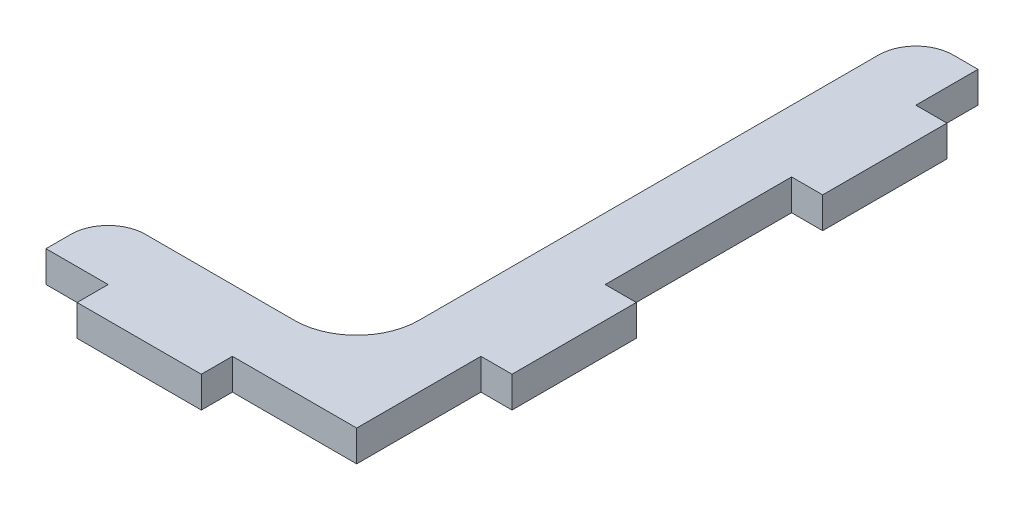
ISO-10303-21;
HEADER;
FILE_DESCRIPTION(('STEP AP214'),'2;1');
FILE_NAME('part.step','',(''),(''),'','','');
FILE_SCHEMA(('AUTOMOTIVE_DESIGN { 1 0 10303 214 1 1 1 1 }'));
ENDSEC;
DATA;
#1=APPLICATION_CONTEXT('core data for automotive mechanical design processes');
#2=APPLICATION_PROTOCOL_DEFINITION('international standard','automotive_design',2000,#1);
#3=PRODUCT_CONTEXT('',#1,'mechanical');
#4=PRODUCT('Part','Part','',(#3));
#5=PRODUCT_RELATED_PRODUCT_CATEGORY('part','',(#4));
#6=PRODUCT_DEFINITION_FORMATION('','',#4);
#7=PRODUCT_DEFINITION_CONTEXT('part definition',#1,'design');
#8=PRODUCT_DEFINITION('design','',#6,#7);
#9=PRODUCT_DEFINITION_SHAPE('','',#8);
#10=(LENGTH_UNIT() NAMED_UNIT(*) SI_UNIT(.MILLI.,.METRE.));
#11=(NAMED_UNIT(*) PLANE_ANGLE_UNIT() SI_UNIT($,.RADIAN.));
#12=(NAMED_UNIT(*) SI_UNIT($,.STERADIAN.) SOLID_ANGLE_UNIT());
#13=UNCERTAINTY_MEASURE_WITH_UNIT(LENGTH_MEASURE(1.E-05),#10,'distance_accuracy_value','');
#14=(GEOMETRIC_REPRESENTATION_CONTEXT(3) GLOBAL_UNCERTAINTY_ASSIGNED_CONTEXT((#13)) GLOBAL_UNIT_ASSIGNED_CONTEXT((#10,
#11,#12)) REPRESENTATION_CONTEXT('',''));
#15=CARTESIAN_POINT('',(0.,0.,0.));
#16=DIRECTION('',(0.,0.,1.));
#17=DIRECTION('',(1.,0.,0.));
#18=AXIS2_PLACEMENT_3D('',#15,#16,#17);
#19=CARTESIAN_POINT('',(-9.5,-2.5,23.));
#20=DIRECTION('',(0.,-1.,0.));
#21=DIRECTION('',(0.,0.,-1.));
#22=AXIS2_PLACEMENT_3D('',#19,#20,#21);
#23=CYLINDRICAL_SURFACE('',#22,3.);
#24=CARTESIAN_POINT('',(-9.5,-2.5,23.));
#25=DIRECTION('',(0.,-1.,0.));
#26=DIRECTION('',(0.,0.,1.));
#27=AXIS2_PLACEMENT_3D('',#24,#25,#26);
#28=CIRCLE('',#27,3.);
#29=CARTESIAN_POINT('',(-12.5,-2.5,23.));
#30=VERTEX_POINT('',#29);
#31=CARTESIAN_POINT('',(-9.5,-2.5,20.));
#32=VERTEX_POINT('',#31);
#33=EDGE_CURVE('E287',#30,#32,#28,.T.);
#34=ORIENTED_EDGE('',*,*,#33,.F.);
#35=DIRECTION('',(0.,-1.,0.));
#36=VECTOR('',#35,1.);
#37=CARTESIAN_POINT('',(-12.5,-2.5,23.));
#38=LINE('',#37,#36);
#39=CARTESIAN_POINT('',(-12.5,0.,23.));
#40=VERTEX_POINT('',#39);
#41=EDGE_CURVE('E381',#40,#30,#38,.T.);
#42=ORIENTED_EDGE('',*,*,#41,.F.);
#43=CARTESIAN_POINT('',(-9.5,0.,23.));
#44=DIRECTION('',(0.,1.,0.));
#45=DIRECTION('',(0.,0.,1.));
#46=AXIS2_PLACEMENT_3D('',#43,#44,#45);
#47=CIRCLE('',#46,3.);
#48=CARTESIAN_POINT('',(-9.5,0.,20.));
#49=VERTEX_POINT('',#48);
#50=EDGE_CURVE('E304',#49,#40,#47,.T.);
#51=ORIENTED_EDGE('',*,*,#50,.F.);
#52=DIRECTION('',(0.,1.,0.));
#53=VECTOR('',#52,1.);
#54=CARTESIAN_POINT('',(-9.5,0.,20.));
#55=LINE('',#54,#53);
#56=EDGE_CURVE('E26',#32,#49,#55,.T.);
#57=ORIENTED_EDGE('',*,*,#56,.F.);
#58=EDGE_LOOP('',(#34,#42,#51,#57));
#59=FACE_BOUND('',#58,.T.);
#60=ADVANCED_FACE('F17',(#59),#23,.T.);
#61=CARTESIAN_POINT('',(10.5,-2.5,-22.));
#62=DIRECTION('',(0.,-1.,0.));
#63=DIRECTION('',(0.,0.,-1.));
#64=AXIS2_PLACEMENT_3D('',#61,#62,#63);
#65=CYLINDRICAL_SURFACE('',#64,3.);
#66=CARTESIAN_POINT('',(10.5,-2.5,-22.));
#67=DIRECTION('',(0.,-1.,0.));
#68=DIRECTION('',(0.,0.,1.));
#69=AXIS2_PLACEMENT_3D('',#66,#67,#68);
#70=CIRCLE('',#69,3.);
#71=CARTESIAN_POINT('',(7.5,-2.5,-22.));
#72=VERTEX_POINT('',#71);
#73=CARTESIAN_POINT('',(10.5,-2.5,-25.));
#74=VERTEX_POINT('',#73);
#75=EDGE_CURVE('E234',#72,#74,#70,.T.);
#76=ORIENTED_EDGE('',*,*,#75,.F.);
#77=DIRECTION('',(0.,-1.,0.));
#78=VECTOR('',#77,1.);
#79=CARTESIAN_POINT('',(7.5,-2.5,-22.));
#80=LINE('',#79,#78);
#81=CARTESIAN_POINT('',(7.5,0.,-22.));
#82=VERTEX_POINT('',#81);
#83=EDGE_CURVE('E223',#82,#72,#80,.T.);
#84=ORIENTED_EDGE('',*,*,#83,.F.);
#85=CARTESIAN_POINT('',(10.5,0.,-22.));
#86=DIRECTION('',(0.,1.,0.));
#87=DIRECTION('',(0.,0.,1.));
#88=AXIS2_PLACEMENT_3D('',#85,#86,#87);
#89=CIRCLE('',#88,3.);
#90=CARTESIAN_POINT('',(10.5,0.,-25.));
#91=VERTEX_POINT('',#90);
#92=EDGE_CURVE('E293',#91,#82,#89,.T.);
#93=ORIENTED_EDGE('',*,*,#92,.F.);
#94=DIRECTION('',(0.,1.,0.));
#95=VECTOR('',#94,1.);
#96=CARTESIAN_POINT('',(10.5,0.,-25.));
#97=LINE('',#96,#95);
#98=EDGE_CURVE('E237',#74,#91,#97,.T.);
#99=ORIENTED_EDGE('',*,*,#98,.F.);
#100=EDGE_LOOP('',(#76,#84,#93,#99));
#101=FACE_BOUND('',#100,.T.);
#102=ADVANCED_FACE('F235',(#101),#65,.T.);
#103=CARTESIAN_POINT('',(2.5,-2.5,15.));
#104=DIRECTION('',(0.,-1.,0.));
#105=DIRECTION('',(0.,0.,-1.));
#106=AXIS2_PLACEMENT_3D('',#103,#104,#105);
#107=CYLINDRICAL_SURFACE('',#106,5.);
#108=CARTESIAN_POINT('',(2.5,-2.5,15.));
#109=DIRECTION('',(0.,1.,0.));
#110=DIRECTION('',(0.,0.,1.));
#111=AXIS2_PLACEMENT_3D('',#108,#109,#110);
#112=CIRCLE('',#111,5.);
#113=CARTESIAN_POINT('',(2.5,-2.5,20.));
#114=VERTEX_POINT('',#113);
#115=CARTESIAN_POINT('',(7.5,-2.5,15.));
#116=VERTEX_POINT('',#115);
#117=EDGE_CURVE('E246',#114,#116,#112,.T.);
#118=ORIENTED_EDGE('',*,*,#117,.F.);
#119=DIRECTION('',(0.,-1.,0.));
#120=VECTOR('',#119,1.);
#121=CARTESIAN_POINT('',(2.5,-2.5,20.));
#122=LINE('',#121,#120);
#123=CARTESIAN_POINT('',(2.5,0.,20.));
#124=VERTEX_POINT('',#123);
#125=EDGE_CURVE('E11',#124,#114,#122,.T.);
#126=ORIENTED_EDGE('',*,*,#125,.F.);
#127=CARTESIAN_POINT('',(2.5,0.,15.));
#128=DIRECTION('',(0.,-1.,0.));
#129=DIRECTION('',(0.,0.,1.));
#130=AXIS2_PLACEMENT_3D('',#127,#128,#129);
#131=CIRCLE('',#130,5.);
#132=CARTESIAN_POINT('',(7.5,0.,15.));
#133=VERTEX_POINT('',#132);
#134=EDGE_CURVE('E296',#133,#124,#131,.T.);
#135=ORIENTED_EDGE('',*,*,#134,.F.);
#136=DIRECTION('',(0.,1.,0.));
#137=VECTOR('',#136,1.);
#138=CARTESIAN_POINT('',(7.5,0.,15.));
#139=LINE('',#138,#137);
#140=EDGE_CURVE('E215',#116,#133,#139,.T.);
#141=ORIENTED_EDGE('',*,*,#140,.F.);
#142=EDGE_LOOP('',(#118,#126,#135,#141));
#143=FACE_BOUND('',#142,.T.);
#144=ADVANCED_FACE('F490',(#143),#107,.F.);
#145=CARTESIAN_POINT('',(-12.5,-2.5,20.));
#146=DIRECTION('',(0.,0.,1.));
#147=DIRECTION('',(1.,0.,0.));
#148=AXIS2_PLACEMENT_3D('',#145,#146,#147);
#149=PLANE('',#148);
#150=DIRECTION('',(1.,0.,0.));
#151=VECTOR('',#150,1.);
#152=CARTESIAN_POINT('',(-12.5,-2.5,20.));
#153=LINE('',#152,#151);
#154=EDGE_CURVE('E288',#32,#114,#153,.T.);
#155=ORIENTED_EDGE('',*,*,#154,.F.);
#156=ORIENTED_EDGE('',*,*,#56,.T.);
#157=DIRECTION('',(1.,0.,0.));
#158=VECTOR('',#157,1.);
#159=CARTESIAN_POINT('',(-12.5,0.,20.));
#160=LINE('',#159,#158);
#161=EDGE_CURVE('E300',#49,#124,#160,.T.);
#162=ORIENTED_EDGE('',*,*,#161,.T.);
#163=ORIENTED_EDGE('',*,*,#125,.T.);
#164=EDGE_LOOP('',(#155,#156,#162,#163));
#165=FACE_BOUND('',#164,.T.);
#166=ADVANCED_FACE('F489',(#165),#149,.F.);
#167=CARTESIAN_POINT('',(7.5,-2.5,-25.));
#168=DIRECTION('',(1.,0.,0.));
#169=DIRECTION('',(0.,0.,-1.));
#170=AXIS2_PLACEMENT_3D('',#167,#168,#169);
#171=PLANE('',#170);
#172=DIRECTION('',(0.,0.,-1.));
#173=VECTOR('',#172,1.);
#174=CARTESIAN_POINT('',(7.5,0.,-25.));
#175=LINE('',#174,#173);
#176=EDGE_CURVE('E229',#133,#82,#175,.T.);
#177=ORIENTED_EDGE('',*,*,#176,.T.);
#178=ORIENTED_EDGE('',*,*,#83,.T.);
#179=DIRECTION('',(0.,0.,-1.));
#180=VECTOR('',#179,1.);
#181=CARTESIAN_POINT('',(7.5,-2.5,-25.));
#182=LINE('',#181,#180);
#183=EDGE_CURVE('E227',#116,#72,#182,.T.);
#184=ORIENTED_EDGE('',*,*,#183,.F.);
#185=ORIENTED_EDGE('',*,*,#140,.T.);
#186=EDGE_LOOP('',(#177,#178,#184,#185));
#187=FACE_BOUND('',#186,.T.);
#188=ADVANCED_FACE('F225',(#187),#171,.F.);
#189=CARTESIAN_POINT('',(15.,0.,0.));
#190=DIRECTION('',(-1.,0.,0.));
#191=DIRECTION('',(0.,0.,1.));
#192=AXIS2_PLACEMENT_3D('',#189,#190,#191);
#193=PLANE('',#192);
#194=DIRECTION('',(0.,1.,0.));
#195=VECTOR('',#194,1.);
#196=CARTESIAN_POINT('',(15.,-2.5,5.));
#197=LINE('',#196,#195);
#198=CARTESIAN_POINT('',(15.,-2.5,5.));
#199=VERTEX_POINT('',#198);
#200=CARTESIAN_POINT('',(15.,0.,5.));
#201=VERTEX_POINT('',#200);
#202=EDGE_CURVE('E103',#199,#201,#197,.T.);
#203=ORIENTED_EDGE('',*,*,#202,.T.);
#204=DIRECTION('',(0.,0.,1.));
#205=VECTOR('',#204,1.);
#206=CARTESIAN_POINT('',(15.,0.,15.));
#207=LINE('',#206,#205);
#208=CARTESIAN_POINT('',(15.,0.,15.));
#209=VERTEX_POINT('',#208);
#210=EDGE_CURVE('E317',#201,#209,#207,.T.);
#211=ORIENTED_EDGE('',*,*,#210,.T.);
#212=DIRECTION('',(0.,-1.,0.));
#213=VECTOR('',#212,1.);
#214=CARTESIAN_POINT('',(15.,-2.5,15.));
#215=LINE('',#214,#213);
#216=CARTESIAN_POINT('',(15.,-2.5,15.));
#217=VERTEX_POINT('',#216);
#218=EDGE_CURVE('E115',#209,#217,#215,.T.);
#219=ORIENTED_EDGE('',*,*,#218,.T.);
#220=DIRECTION('',(0.,0.,-1.));
#221=VECTOR('',#220,1.);
#222=CARTESIAN_POINT('',(15.,-2.5,15.));
#223=LINE('',#222,#221);
#224=EDGE_CURVE('E273',#217,#199,#223,.T.);
#225=ORIENTED_EDGE('',*,*,#224,.T.);
#226=EDGE_LOOP('',(#203,#211,#219,#225));
#227=FACE_BOUND('',#226,.T.);
#228=ADVANCED_FACE('F638',(#227),#193,.F.);
#229=CARTESIAN_POINT('',(15.,-2.5,15.));
#230=DIRECTION('',(0.,0.,-1.));
#231=DIRECTION('',(0.,-1.,0.));
#232=AXIS2_PLACEMENT_3D('',#229,#230,#231);
#233=PLANE('',#232);
#234=DIRECTION('',(0.,-1.,0.));
#235=VECTOR('',#234,1.);
#236=CARTESIAN_POINT('',(12.5,-2.5,15.));
#237=LINE('',#236,#235);
#238=CARTESIAN_POINT('',(12.5,0.,15.));
#239=VERTEX_POINT('',#238);
#240=CARTESIAN_POINT('',(12.5,-2.5,15.));
#241=VERTEX_POINT('',#240);
#242=EDGE_CURVE('E364',#239,#241,#237,.T.);
#243=ORIENTED_EDGE('',*,*,#242,.T.);
#244=DIRECTION('',(-1.,0.,0.));
#245=VECTOR('',#244,1.);
#246=CARTESIAN_POINT('',(15.,-2.5,15.));
#247=LINE('',#246,#245);
#248=EDGE_CURVE('E274',#217,#241,#247,.T.);
#249=ORIENTED_EDGE('',*,*,#248,.F.);
#250=ORIENTED_EDGE('',*,*,#218,.F.);
#251=DIRECTION('',(-1.,0.,0.));
#252=VECTOR('',#251,1.);
#253=CARTESIAN_POINT('',(15.,0.,15.));
#254=LINE('',#253,#252);
#255=EDGE_CURVE('E314',#209,#239,#254,.T.);
#256=ORIENTED_EDGE('',*,*,#255,.T.);
#257=EDGE_LOOP('',(#243,#249,#250,#256));
#258=FACE_BOUND('',#257,.T.);
#259=ADVANCED_FACE('F627',(#258),#233,.F.);
#260=CARTESIAN_POINT('',(15.,-2.5,5.));
#261=DIRECTION('',(0.,0.,1.));
#262=DIRECTION('',(1.,0.,0.));
#263=AXIS2_PLACEMENT_3D('',#260,#261,#262);
#264=PLANE('',#263);
#265=DIRECTION('',(0.,1.,0.));
#266=VECTOR('',#265,1.);
#267=CARTESIAN_POINT('',(12.5,-2.5,5.));
#268=LINE('',#267,#266);
#269=CARTESIAN_POINT('',(12.5,-2.5,5.));
#270=VERTEX_POINT('',#269);
#271=CARTESIAN_POINT('',(12.5,0.,5.));
#272=VERTEX_POINT('',#271);
#273=EDGE_CURVE('E1263',#270,#272,#268,.T.);
#274=ORIENTED_EDGE('',*,*,#273,.T.);
#275=DIRECTION('',(-1.,0.,0.));
#276=VECTOR('',#275,1.);
#277=CARTESIAN_POINT('',(15.,0.,5.));
#278=LINE('',#277,#276);
#279=EDGE_CURVE('E269',#201,#272,#278,.T.);
#280=ORIENTED_EDGE('',*,*,#279,.F.);
#281=ORIENTED_EDGE('',*,*,#202,.F.);
#282=DIRECTION('',(-1.,0.,0.));
#283=VECTOR('',#282,1.);
#284=CARTESIAN_POINT('',(15.,-2.5,5.));
#285=LINE('',#284,#283);
#286=EDGE_CURVE('E270',#199,#270,#285,.T.);
#287=ORIENTED_EDGE('',*,*,#286,.T.);
#288=EDGE_LOOP('',(#274,#280,#281,#287));
#289=FACE_BOUND('',#288,.T.);
#290=ADVANCED_FACE('F617',(#289),#264,.F.);
#291=CARTESIAN_POINT('',(15.,0.,0.));
#292=DIRECTION('',(1.,0.,0.));
#293=DIRECTION('',(0.,1.,0.));
#294=AXIS2_PLACEMENT_3D('',#291,#292,#293);
#295=PLANE('',#294);
#296=DIRECTION('',(0.,-1.,0.));
#297=VECTOR('',#296,1.);
#298=CARTESIAN_POINT('',(15.,-2.5,-10.));
#299=LINE('',#298,#297);
#300=CARTESIAN_POINT('',(15.,0.,-10.));
#301=VERTEX_POINT('',#300);
#302=CARTESIAN_POINT('',(15.,-2.5,-10.));
#303=VERTEX_POINT('',#302);
#304=EDGE_CURVE('E333',#301,#303,#299,.T.);
#305=ORIENTED_EDGE('',*,*,#304,.T.);
#306=DIRECTION('',(0.,0.,-1.));
#307=VECTOR('',#306,1.);
#308=CARTESIAN_POINT('',(15.,-2.5,-20.));
#309=LINE('',#308,#307);
#310=CARTESIAN_POINT('',(15.,-2.5,-20.));
#311=VERTEX_POINT('',#310);
#312=EDGE_CURVE('E261',#303,#311,#309,.T.);
#313=ORIENTED_EDGE('',*,*,#312,.T.);
#314=DIRECTION('',(0.,1.,0.));
#315=VECTOR('',#314,1.);
#316=CARTESIAN_POINT('',(15.,-2.5,-20.));
#317=LINE('',#316,#315);
#318=CARTESIAN_POINT('',(15.,0.,-20.));
#319=VERTEX_POINT('',#318);
#320=EDGE_CURVE('E39',#311,#319,#317,.T.);
#321=ORIENTED_EDGE('',*,*,#320,.T.);
#322=DIRECTION('',(0.,0.,1.));
#323=VECTOR('',#322,1.);
#324=CARTESIAN_POINT('',(15.,0.,-20.));
#325=LINE('',#324,#323);
#326=EDGE_CURVE('E268',#319,#301,#325,.T.);
#327=ORIENTED_EDGE('',*,*,#326,.T.);
#328=EDGE_LOOP('',(#305,#313,#321,#327));
#329=FACE_BOUND('',#328,.T.);
#330=ADVANCED_FACE('F554',(#329),#295,.T.);
#331=CARTESIAN_POINT('',(15.,-2.5,-20.));
#332=DIRECTION('',(0.,0.,1.));
#333=DIRECTION('',(1.,0.,0.));
#334=AXIS2_PLACEMENT_3D('',#331,#332,#333);
#335=PLANE('',#334);
#336=DIRECTION('',(0.,1.,0.));
#337=VECTOR('',#336,1.);
#338=CARTESIAN_POINT('',(12.5,-2.5,-20.));
#339=LINE('',#338,#337);
#340=CARTESIAN_POINT('',(12.5,-2.5,-20.));
#341=VERTEX_POINT('',#340);
#342=CARTESIAN_POINT('',(12.5,0.,-20.));
#343=VERTEX_POINT('',#342);
#344=EDGE_CURVE('E413',#341,#343,#339,.T.);
#345=ORIENTED_EDGE('',*,*,#344,.T.);
#346=DIRECTION('',(-1.,0.,0.));
#347=VECTOR('',#346,1.);
#348=CARTESIAN_POINT('',(15.,0.,-20.));
#349=LINE('',#348,#347);
#350=EDGE_CURVE('E324',#319,#343,#349,.T.);
#351=ORIENTED_EDGE('',*,*,#350,.F.);
#352=ORIENTED_EDGE('',*,*,#320,.F.);
#353=DIRECTION('',(-1.,0.,0.));
#354=VECTOR('',#353,1.);
#355=CARTESIAN_POINT('',(15.,-2.5,-20.));
#356=LINE('',#355,#354);
#357=EDGE_CURVE('E242',#311,#341,#356,.T.);
#358=ORIENTED_EDGE('',*,*,#357,.T.);
#359=EDGE_LOOP('',(#345,#351,#352,#358));
#360=FACE_BOUND('',#359,.T.);
#361=ADVANCED_FACE('F548',(#360),#335,.F.);
#362=CARTESIAN_POINT('',(15.,-2.5,-10.));
#363=DIRECTION('',(0.,0.,-1.));
#364=DIRECTION('',(0.,-1.,0.));
#365=AXIS2_PLACEMENT_3D('',#362,#363,#364);
#366=PLANE('',#365);
#367=DIRECTION('',(0.,-1.,0.));
#368=VECTOR('',#367,1.);
#369=CARTESIAN_POINT('',(12.5,-2.5,-10.));
#370=LINE('',#369,#368);
#371=CARTESIAN_POINT('',(12.5,0.,-10.));
#372=VERTEX_POINT('',#371);
#373=CARTESIAN_POINT('',(12.5,-2.5,-10.));
#374=VERTEX_POINT('',#373);
#375=EDGE_CURVE('E352',#372,#374,#370,.T.);
#376=ORIENTED_EDGE('',*,*,#375,.T.);
#377=DIRECTION('',(-1.,0.,0.));
#378=VECTOR('',#377,1.);
#379=CARTESIAN_POINT('',(15.,-2.5,-10.));
#380=LINE('',#379,#378);
#381=EDGE_CURVE('E264',#303,#374,#380,.T.);
#382=ORIENTED_EDGE('',*,*,#381,.F.);
#383=ORIENTED_EDGE('',*,*,#304,.F.);
#384=DIRECTION('',(-1.,0.,0.));
#385=VECTOR('',#384,1.);
#386=CARTESIAN_POINT('',(15.,0.,-10.));
#387=LINE('',#386,#385);
#388=EDGE_CURVE('E265',#301,#372,#387,.T.);
#389=ORIENTED_EDGE('',*,*,#388,.T.);
#390=EDGE_LOOP('',(#376,#382,#383,#389));
#391=FACE_BOUND('',#390,.T.);
#392=ADVANCED_FACE('F553',(#391),#366,.F.);
#393=CARTESIAN_POINT('',(0.,0.,27.5));
#394=DIRECTION('',(0.,0.,1.));
#395=DIRECTION('',(1.,0.,0.));
#396=AXIS2_PLACEMENT_3D('',#393,#394,#395);
#397=PLANE('',#396);
#398=DIRECTION('',(0.,-1.,0.));
#399=VECTOR('',#398,1.);
#400=CARTESIAN_POINT('',(-7.5,-2.5,27.5));
#401=LINE('',#400,#399);
#402=CARTESIAN_POINT('',(-7.5,0.,27.5));
#403=VERTEX_POINT('',#402);
#404=CARTESIAN_POINT('',(-7.5,-2.5,27.5));
#405=VERTEX_POINT('',#404);
#406=EDGE_CURVE('E327',#403,#405,#401,.T.);
#407=ORIENTED_EDGE('',*,*,#406,.T.);
#408=DIRECTION('',(1.,0.,0.));
#409=VECTOR('',#408,1.);
#410=CARTESIAN_POINT('',(2.5,-2.5,27.5));
#411=LINE('',#410,#409);
#412=CARTESIAN_POINT('',(2.5,-2.5,27.5));
#413=VERTEX_POINT('',#412);
#414=EDGE_CURVE('E280',#405,#413,#411,.T.);
#415=ORIENTED_EDGE('',*,*,#414,.T.);
#416=DIRECTION('',(0.,1.,0.));
#417=VECTOR('',#416,1.);
#418=CARTESIAN_POINT('',(2.5,-2.5,27.5));
#419=LINE('',#418,#417);
#420=CARTESIAN_POINT('',(2.5,0.,27.5));
#421=VERTEX_POINT('',#420);
#422=EDGE_CURVE('E330',#413,#421,#419,.T.);
#423=ORIENTED_EDGE('',*,*,#422,.T.);
#424=DIRECTION('',(-1.,0.,0.));
#425=VECTOR('',#424,1.);
#426=CARTESIAN_POINT('',(2.5,0.,27.5));
#427=LINE('',#426,#425);
#428=EDGE_CURVE('E310',#421,#403,#427,.T.);
#429=ORIENTED_EDGE('',*,*,#428,.T.);
#430=EDGE_LOOP('',(#407,#415,#423,#429));
#431=FACE_BOUND('',#430,.T.);
#432=ADVANCED_FACE('F472',(#431),#397,.T.);
#433=CARTESIAN_POINT('',(2.5,-2.5,27.5));
#434=DIRECTION('',(-1.,0.,0.));
#435=DIRECTION('',(0.,0.,1.));
#436=AXIS2_PLACEMENT_3D('',#433,#434,#435);
#437=PLANE('',#436);
#438=DIRECTION('',(0.,1.,0.));
#439=VECTOR('',#438,1.);
#440=CARTESIAN_POINT('',(2.5,-2.5,25.));
#441=LINE('',#440,#439);
#442=CARTESIAN_POINT('',(2.5,-2.5,25.));
#443=VERTEX_POINT('',#442);
#444=CARTESIAN_POINT('',(2.5,0.,25.));
#445=VERTEX_POINT('',#444);
#446=EDGE_CURVE('E440',#443,#445,#441,.T.);
#447=ORIENTED_EDGE('',*,*,#446,.T.);
#448=DIRECTION('',(0.,0.,-1.));
#449=VECTOR('',#448,1.);
#450=CARTESIAN_POINT('',(2.5,0.,27.5));
#451=LINE('',#450,#449);
#452=EDGE_CURVE('E311',#421,#445,#451,.T.);
#453=ORIENTED_EDGE('',*,*,#452,.F.);
#454=ORIENTED_EDGE('',*,*,#422,.F.);
#455=DIRECTION('',(0.,0.,-1.));
#456=VECTOR('',#455,1.);
#457=CARTESIAN_POINT('',(2.5,-2.5,27.5));
#458=LINE('',#457,#456);
#459=EDGE_CURVE('E277',#413,#443,#458,.T.);
#460=ORIENTED_EDGE('',*,*,#459,.T.);
#461=EDGE_LOOP('',(#447,#453,#454,#460));
#462=FACE_BOUND('',#461,.T.);
#463=ADVANCED_FACE('F469',(#462),#437,.F.);
#464=CARTESIAN_POINT('',(-7.5,-2.5,27.5));
#465=DIRECTION('',(1.,0.,0.));
#466=DIRECTION('',(0.,1.,0.));
#467=AXIS2_PLACEMENT_3D('',#464,#465,#466);
#468=PLANE('',#467);
#469=DIRECTION('',(0.,-1.,0.));
#470=VECTOR('',#469,1.);
#471=CARTESIAN_POINT('',(-7.5,-2.5,25.));
#472=LINE('',#471,#470);
#473=CARTESIAN_POINT('',(-7.5,0.,25.));
#474=VERTEX_POINT('',#473);
#475=CARTESIAN_POINT('',(-7.5,-2.5,25.));
#476=VERTEX_POINT('',#475);
#477=EDGE_CURVE('E394',#474,#476,#472,.T.);
#478=ORIENTED_EDGE('',*,*,#477,.T.);
#479=DIRECTION('',(0.,0.,-1.));
#480=VECTOR('',#479,1.);
#481=CARTESIAN_POINT('',(-7.5,-2.5,27.5));
#482=LINE('',#481,#480);
#483=EDGE_CURVE('E284',#405,#476,#482,.T.);
#484=ORIENTED_EDGE('',*,*,#483,.F.);
#485=ORIENTED_EDGE('',*,*,#406,.F.);
#486=DIRECTION('',(0.,0.,-1.));
#487=VECTOR('',#486,1.);
#488=CARTESIAN_POINT('',(-7.5,0.,27.5));
#489=LINE('',#488,#487);
#490=EDGE_CURVE('E307',#403,#474,#489,.T.);
#491=ORIENTED_EDGE('',*,*,#490,.T.);
#492=EDGE_LOOP('',(#478,#484,#485,#491));
#493=FACE_BOUND('',#492,.T.);
#494=ADVANCED_FACE('F482',(#493),#468,.F.);
#495=CARTESIAN_POINT('',(0.,0.,0.));
#496=DIRECTION('',(0.,1.,0.));
#497=DIRECTION('',(1.,0.,0.));
#498=AXIS2_PLACEMENT_3D('',#495,#496,#497);
#499=PLANE('',#498);
#500=DIRECTION('',(-1.,0.,0.));
#501=VECTOR('',#500,1.);
#502=CARTESIAN_POINT('',(12.5,0.,-25.));
#503=LINE('',#502,#501);
#504=CARTESIAN_POINT('',(12.5,0.,-25.));
#505=VERTEX_POINT('',#504);
#506=EDGE_CURVE('E421',#505,#91,#503,.T.);
#507=ORIENTED_EDGE('',*,*,#506,.T.);
#508=ORIENTED_EDGE('',*,*,#92,.T.);
#509=ORIENTED_EDGE('',*,*,#176,.F.);
#510=ORIENTED_EDGE('',*,*,#134,.T.);
#511=ORIENTED_EDGE('',*,*,#161,.F.);
#512=ORIENTED_EDGE('',*,*,#50,.T.);
#513=DIRECTION('',(0.,0.,1.));
#514=VECTOR('',#513,1.);
#515=CARTESIAN_POINT('',(-12.5,0.,25.));
#516=LINE('',#515,#514);
#517=CARTESIAN_POINT('',(-12.5,0.,25.));
#518=VERTEX_POINT('',#517);
#519=EDGE_CURVE('E386',#40,#518,#516,.T.);
#520=ORIENTED_EDGE('',*,*,#519,.T.);
#521=DIRECTION('',(1.,0.,0.));
#522=VECTOR('',#521,1.);
#523=CARTESIAN_POINT('',(12.5,0.,25.));
#524=LINE('',#523,#522);
#525=EDGE_CURVE('E376',#518,#474,#524,.T.);
#526=ORIENTED_EDGE('',*,*,#525,.T.);
#527=ORIENTED_EDGE('',*,*,#490,.F.);
#528=ORIENTED_EDGE('',*,*,#428,.F.);
#529=ORIENTED_EDGE('',*,*,#452,.T.);
#530=DIRECTION('',(1.,0.,0.));
#531=VECTOR('',#530,1.);
#532=CARTESIAN_POINT('',(12.5,0.,25.));
#533=LINE('',#532,#531);
#534=CARTESIAN_POINT('',(12.5,0.,25.));
#535=VERTEX_POINT('',#534);
#536=EDGE_CURVE('E248',#445,#535,#533,.T.);
#537=ORIENTED_EDGE('',*,*,#536,.T.);
#538=DIRECTION('',(0.,0.,-1.));
#539=VECTOR('',#538,1.);
#540=CARTESIAN_POINT('',(12.5,0.,25.));
#541=LINE('',#540,#539);
#542=EDGE_CURVE('E359',#535,#239,#541,.T.);
#543=ORIENTED_EDGE('',*,*,#542,.T.);
#544=ORIENTED_EDGE('',*,*,#255,.F.);
#545=ORIENTED_EDGE('',*,*,#210,.F.);
#546=ORIENTED_EDGE('',*,*,#279,.T.);
#547=DIRECTION('',(0.,0.,-1.));
#548=VECTOR('',#547,1.);
#549=CARTESIAN_POINT('',(12.5,0.,25.));
#550=LINE('',#549,#548);
#551=EDGE_CURVE('E356',#272,#372,#550,.T.);
#552=ORIENTED_EDGE('',*,*,#551,.T.);
#553=ORIENTED_EDGE('',*,*,#388,.F.);
#554=ORIENTED_EDGE('',*,*,#326,.F.);
#555=ORIENTED_EDGE('',*,*,#350,.T.);
#556=DIRECTION('',(0.,0.,-1.));
#557=VECTOR('',#556,1.);
#558=CARTESIAN_POINT('',(12.5,0.,25.));
#559=LINE('',#558,#557);
#560=EDGE_CURVE('E438',#343,#505,#559,.T.);
#561=ORIENTED_EDGE('',*,*,#560,.T.);
#562=EDGE_LOOP('',(#507,#508,#509,#510,#511,#512,#520,#526,#527,#528,#529,#537,#543,#544,#545,
#546,#552,#553,#554,#555,#561));
#563=FACE_BOUND('',#562,.T.);
#564=ADVANCED_FACE('F465',(#563),#499,.T.);
#565=CARTESIAN_POINT('',(0.,-2.5,0.));
#566=DIRECTION('',(0.,1.,0.));
#567=DIRECTION('',(1.,0.,0.));
#568=AXIS2_PLACEMENT_3D('',#565,#566,#567);
#569=PLANE('',#568);
#570=ORIENTED_EDGE('',*,*,#183,.T.);
#571=ORIENTED_EDGE('',*,*,#75,.T.);
#572=DIRECTION('',(-1.,0.,0.));
#573=VECTOR('',#572,1.);
#574=CARTESIAN_POINT('',(12.5,-2.5,-25.));
#575=LINE('',#574,#573);
#576=CARTESIAN_POINT('',(12.5,-2.5,-25.));
#577=VERTEX_POINT('',#576);
#578=EDGE_CURVE('E410',#577,#74,#575,.T.);
#579=ORIENTED_EDGE('',*,*,#578,.F.);
#580=DIRECTION('',(0.,0.,-1.));
#581=VECTOR('',#580,1.);
#582=CARTESIAN_POINT('',(12.5,-2.5,25.));
#583=LINE('',#582,#581);
#584=EDGE_CURVE('E417',#341,#577,#583,.T.);
#585=ORIENTED_EDGE('',*,*,#584,.F.);
#586=ORIENTED_EDGE('',*,*,#357,.F.);
#587=ORIENTED_EDGE('',*,*,#312,.F.);
#588=ORIENTED_EDGE('',*,*,#381,.T.);
#589=DIRECTION('',(0.,0.,-1.));
#590=VECTOR('',#589,1.);
#591=CARTESIAN_POINT('',(12.5,-2.5,25.));
#592=LINE('',#591,#590);
#593=EDGE_CURVE('E350',#270,#374,#592,.T.);
#594=ORIENTED_EDGE('',*,*,#593,.F.);
#595=ORIENTED_EDGE('',*,*,#286,.F.);
#596=ORIENTED_EDGE('',*,*,#224,.F.);
#597=ORIENTED_EDGE('',*,*,#248,.T.);
#598=DIRECTION('',(0.,0.,-1.));
#599=VECTOR('',#598,1.);
#600=CARTESIAN_POINT('',(12.5,-2.5,25.));
#601=LINE('',#600,#599);
#602=CARTESIAN_POINT('',(12.5,-2.5,25.));
#603=VERTEX_POINT('',#602);
#604=EDGE_CURVE('E380',#603,#241,#601,.T.);
#605=ORIENTED_EDGE('',*,*,#604,.F.);
#606=DIRECTION('',(1.,0.,0.));
#607=VECTOR('',#606,1.);
#608=CARTESIAN_POINT('',(12.5,-2.5,25.));
#609=LINE('',#608,#607);
#610=EDGE_CURVE('E254',#443,#603,#609,.T.);
#611=ORIENTED_EDGE('',*,*,#610,.F.);
#612=ORIENTED_EDGE('',*,*,#459,.F.);
#613=ORIENTED_EDGE('',*,*,#414,.F.);
#614=ORIENTED_EDGE('',*,*,#483,.T.);
#615=DIRECTION('',(1.,0.,0.));
#616=VECTOR('',#615,1.);
#617=CARTESIAN_POINT('',(12.5,-2.5,25.));
#618=LINE('',#617,#616);
#619=CARTESIAN_POINT('',(-12.5,-2.5,25.));
#620=VERTEX_POINT('',#619);
#621=EDGE_CURVE('E375',#620,#476,#618,.T.);
#622=ORIENTED_EDGE('',*,*,#621,.F.);
#623=DIRECTION('',(0.,0.,1.));
#624=VECTOR('',#623,1.);
#625=CARTESIAN_POINT('',(-12.5,-2.5,25.));
#626=LINE('',#625,#624);
#627=EDGE_CURVE('E385',#30,#620,#626,.T.);
#628=ORIENTED_EDGE('',*,*,#627,.F.);
#629=ORIENTED_EDGE('',*,*,#33,.T.);
#630=ORIENTED_EDGE('',*,*,#154,.T.);
#631=ORIENTED_EDGE('',*,*,#117,.T.);
#632=EDGE_LOOP('',(#570,#571,#579,#585,#586,#587,#588,#594,#595,#596,#597,#605,#611,#612,#613,
#614,#622,#628,#629,#630,#631));
#633=FACE_BOUND('',#632,.T.);
#634=ADVANCED_FACE('F244',(#633),#569,.F.);
#635=CARTESIAN_POINT('',(12.5,-2.5,25.));
#636=DIRECTION('',(0.,0.,1.));
#637=DIRECTION('',(1.,0.,0.));
#638=AXIS2_PLACEMENT_3D('',#635,#636,#637);
#639=PLANE('',#638);
#640=ORIENTED_EDGE('',*,*,#446,.F.);
#641=ORIENTED_EDGE('',*,*,#610,.T.);
#642=DIRECTION('',(0.,1.,0.));
#643=VECTOR('',#642,1.);
#644=CARTESIAN_POINT('',(12.5,-2.5,25.));
#645=LINE('',#644,#643);
#646=EDGE_CURVE('E363',#603,#535,#645,.T.);
#647=ORIENTED_EDGE('',*,*,#646,.T.);
#648=ORIENTED_EDGE('',*,*,#536,.F.);
#649=EDGE_LOOP('',(#640,#641,#647,#648));
#650=FACE_BOUND('',#649,.T.);
#651=ADVANCED_FACE('F454',(#650),#639,.T.);
#652=CARTESIAN_POINT('',(12.5,-2.5,25.));
#653=DIRECTION('',(1.,0.,0.));
#654=DIRECTION('',(0.,1.,0.));
#655=AXIS2_PLACEMENT_3D('',#652,#653,#654);
#656=PLANE('',#655);
#657=ORIENTED_EDGE('',*,*,#344,.F.);
#658=ORIENTED_EDGE('',*,*,#584,.T.);
#659=DIRECTION('',(0.,1.,0.));
#660=VECTOR('',#659,1.);
#661=CARTESIAN_POINT('',(12.5,-2.5,-25.));
#662=LINE('',#661,#660);
#663=EDGE_CURVE('E418',#577,#505,#662,.T.);
#664=ORIENTED_EDGE('',*,*,#663,.T.);
#665=ORIENTED_EDGE('',*,*,#560,.F.);
#666=EDGE_LOOP('',(#657,#658,#664,#665));
#667=FACE_BOUND('',#666,.T.);
#668=ADVANCED_FACE('F576',(#667),#656,.T.);
#669=CARTESIAN_POINT('',(12.5,-2.5,-25.));
#670=DIRECTION('',(0.,0.,-1.));
#671=DIRECTION('',(0.,-1.,0.));
#672=AXIS2_PLACEMENT_3D('',#669,#670,#671);
#673=PLANE('',#672);
#674=ORIENTED_EDGE('',*,*,#578,.T.);
#675=ORIENTED_EDGE('',*,*,#98,.T.);
#676=ORIENTED_EDGE('',*,*,#506,.F.);
#677=ORIENTED_EDGE('',*,*,#663,.F.);
#678=EDGE_LOOP('',(#674,#675,#676,#677));
#679=FACE_BOUND('',#678,.T.);
#680=ADVANCED_FACE('F566',(#679),#673,.T.);
#681=CARTESIAN_POINT('',(-12.5,-2.5,25.));
#682=DIRECTION('',(-1.,0.,0.));
#683=DIRECTION('',(0.,0.,1.));
#684=AXIS2_PLACEMENT_3D('',#681,#682,#683);
#685=PLANE('',#684);
#686=ORIENTED_EDGE('',*,*,#519,.F.);
#687=ORIENTED_EDGE('',*,*,#41,.T.);
#688=ORIENTED_EDGE('',*,*,#627,.T.);
#689=DIRECTION('',(0.,1.,0.));
#690=VECTOR('',#689,1.);
#691=CARTESIAN_POINT('',(-12.5,-2.5,25.));
#692=LINE('',#691,#690);
#693=EDGE_CURVE('E371',#620,#518,#692,.T.);
#694=ORIENTED_EDGE('',*,*,#693,.T.);
#695=EDGE_LOOP('',(#686,#687,#688,#694));
#696=FACE_BOUND('',#695,.T.);
#697=ADVANCED_FACE('F487',(#696),#685,.T.);
#698=CARTESIAN_POINT('',(12.5,-2.5,25.));
#699=DIRECTION('',(0.,0.,1.));
#700=DIRECTION('',(1.,0.,0.));
#701=AXIS2_PLACEMENT_3D('',#698,#699,#700);
#702=PLANE('',#701);
#703=ORIENTED_EDGE('',*,*,#477,.F.);
#704=ORIENTED_EDGE('',*,*,#525,.F.);
#705=ORIENTED_EDGE('',*,*,#693,.F.);
#706=ORIENTED_EDGE('',*,*,#621,.T.);
#707=EDGE_LOOP('',(#703,#704,#705,#706));
#708=FACE_BOUND('',#707,.T.);
#709=ADVANCED_FACE('F480',(#708),#702,.T.);
#710=CARTESIAN_POINT('',(12.5,-2.5,25.));
#711=DIRECTION('',(1.,0.,0.));
#712=DIRECTION('',(0.,1.,0.));
#713=AXIS2_PLACEMENT_3D('',#710,#711,#712);
#714=PLANE('',#713);
#715=ORIENTED_EDGE('',*,*,#242,.F.);
#716=ORIENTED_EDGE('',*,*,#542,.F.);
#717=ORIENTED_EDGE('',*,*,#646,.F.);
#718=ORIENTED_EDGE('',*,*,#604,.T.);
#719=EDGE_LOOP('',(#715,#716,#717,#718));
#720=FACE_BOUND('',#719,.T.);
#721=ADVANCED_FACE('F462',(#720),#714,.T.);
#722=CARTESIAN_POINT('',(12.5,-2.5,25.));
#723=DIRECTION('',(1.,0.,0.));
#724=DIRECTION('',(0.,1.,0.));
#725=AXIS2_PLACEMENT_3D('',#722,#723,#724);
#726=PLANE('',#725);
#727=ORIENTED_EDGE('',*,*,#273,.F.);
#728=ORIENTED_EDGE('',*,*,#593,.T.);
#729=ORIENTED_EDGE('',*,*,#375,.F.);
#730=ORIENTED_EDGE('',*,*,#551,.F.);
#731=EDGE_LOOP('',(#727,#728,#729,#730));
#732=FACE_BOUND('',#731,.T.);
#733=ADVANCED_FACE('F925',(#732),#726,.T.);
#734=CLOSED_SHELL('',(#60,#102,#144,#166,#188,#228,#259,#290,#330,#361,#392,#432,#463,#494,#564,
#634,#651,#668,#680,#697,#709,#721,#733));
#735=MANIFOLD_SOLID_BREP('B1',#734);
#736=ADVANCED_BREP_SHAPE_REPRESENTATION('',(#18,#735),#14);
#737=SHAPE_DEFINITION_REPRESENTATION(#9,#736);
ENDSEC;
END-ISO-10303-21;
